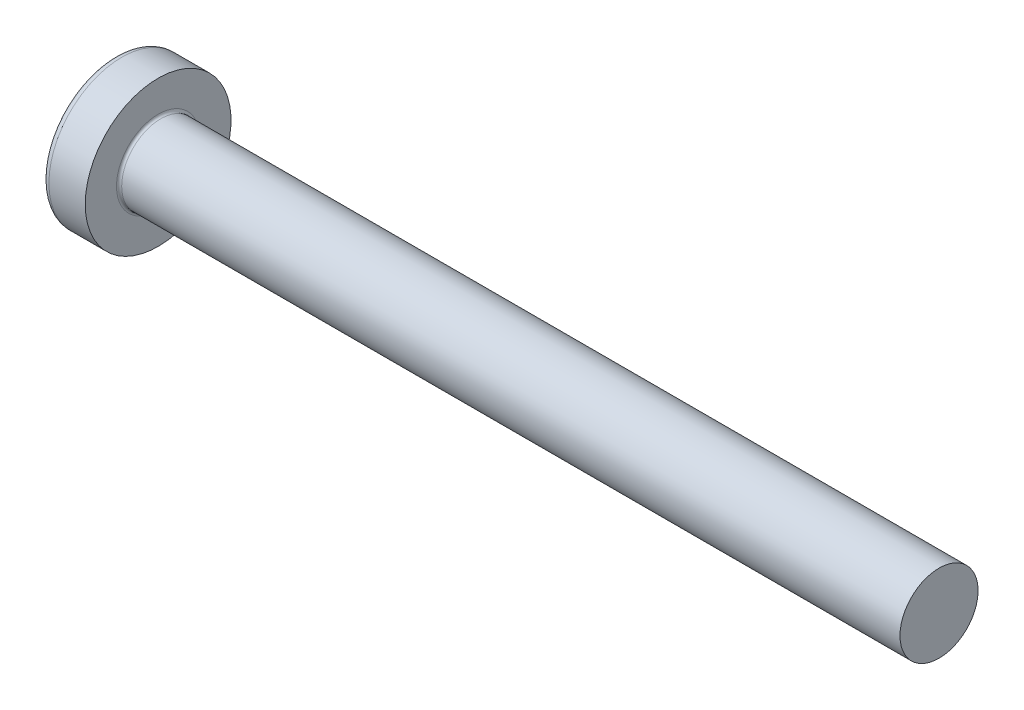
ISO-10303-21;
HEADER;
FILE_DESCRIPTION(('STEP AP214'),'2;1');
FILE_NAME('part.step','',(''),(''),'','','');
FILE_SCHEMA(('AUTOMOTIVE_DESIGN { 1 0 10303 214 1 1 1 1 }'));
ENDSEC;
DATA;
#1=APPLICATION_CONTEXT('core data for automotive mechanical design processes');
#2=APPLICATION_PROTOCOL_DEFINITION('international standard','automotive_design',2000,#1);
#3=PRODUCT_CONTEXT('',#1,'mechanical');
#4=PRODUCT('Part','Part','',(#3));
#5=PRODUCT_RELATED_PRODUCT_CATEGORY('part','',(#4));
#6=PRODUCT_DEFINITION_FORMATION('','',#4);
#7=PRODUCT_DEFINITION_CONTEXT('part definition',#1,'design');
#8=PRODUCT_DEFINITION('design','',#6,#7);
#9=PRODUCT_DEFINITION_SHAPE('','',#8);
#10=(LENGTH_UNIT() NAMED_UNIT(*) SI_UNIT(.MILLI.,.METRE.));
#11=(NAMED_UNIT(*) PLANE_ANGLE_UNIT() SI_UNIT($,.RADIAN.));
#12=(NAMED_UNIT(*) SI_UNIT($,.STERADIAN.) SOLID_ANGLE_UNIT());
#13=UNCERTAINTY_MEASURE_WITH_UNIT(LENGTH_MEASURE(1.E-05),#10,'distance_accuracy_value','');
#14=(GEOMETRIC_REPRESENTATION_CONTEXT(3) GLOBAL_UNCERTAINTY_ASSIGNED_CONTEXT((#13)) GLOBAL_UNIT_ASSIGNED_CONTEXT((#10,
#11,#12)) REPRESENTATION_CONTEXT('',''));
#15=CARTESIAN_POINT('',(0.,0.,0.));
#16=DIRECTION('',(0.,0.,1.));
#17=DIRECTION('',(1.,0.,0.));
#18=AXIS2_PLACEMENT_3D('',#15,#16,#17);
#19=CARTESIAN_POINT('',(5.,0.,0.));
#20=DIRECTION('',(-1.,0.,0.));
#21=DIRECTION('',(0.,1.,0.));
#22=AXIS2_PLACEMENT_3D('',#19,#20,#21);
#23=SPHERICAL_SURFACE('',#22,5.);
#24=CARTESIAN_POINT('',(0.775371598933733,0.,0.));
#25=DIRECTION('',(-1.,0.,0.));
#26=DIRECTION('',(0.,0.,1.));
#27=AXIS2_PLACEMENT_3D('',#24,#25,#26);
#28=CIRCLE('',#27,2.67441860465116);
#29=CARTESIAN_POINT('',(0.775371598933733,0.,2.67441860465116));
#30=VERTEX_POINT('',#29);
#31=EDGE_CURVE('E238',#30,#30,#28,.T.);
#32=ORIENTED_EDGE('',*,*,#31,.T.);
#33=EDGE_LOOP('',(#32));
#34=FACE_BOUND('',#33,.T.);
#35=CARTESIAN_POINT('',(0.0457951200896417,0.,0.));
#36=DIRECTION('',(1.,0.,0.));
#37=DIRECTION('',(0.,0.,-1.));
#38=AXIS2_PLACEMENT_3D('',#35,#36,#37);
#39=CIRCLE('',#38,0.675169614150692);
#40=CARTESIAN_POINT('',(0.0457951200896434,-0.369999999999998,-0.564760133040918));
#41=VERTEX_POINT('',#40);
#42=CARTESIAN_POINT('',(0.0457951200896417,-0.564760133040916,-0.37));
#43=VERTEX_POINT('',#42);
#44=EDGE_CURVE('E374',#41,#43,#39,.F.);
#45=ORIENTED_EDGE('',*,*,#44,.F.);
#46=CARTESIAN_POINT('',(5.,-0.37,0.));
#47=DIRECTION('',(0.,1.,0.));
#48=DIRECTION('',(0.,0.,1.));
#49=AXIS2_PLACEMENT_3D('',#46,#47,#48);
#50=CIRCLE('',#49,4.98629120689917);
#51=CARTESIAN_POINT('',(0.18786973422864,-0.369999999999995,-1.30633162146802));
#52=VERTEX_POINT('',#51);
#53=EDGE_CURVE('E300',#52,#41,#50,.T.);
#54=ORIENTED_EDGE('',*,*,#53,.F.);
#55=CARTESIAN_POINT('',(4.56358262530798,0.,0.875317983305919));
#56=DIRECTION('',(0.446197753347436,0.,-0.894934391398443));
#57=DIRECTION('',(-0.894934391398442,0.,-0.446197753347436));
#58=AXIS2_PLACEMENT_3D('',#55,#56,#57);
#59=CIRCLE('',#58,4.90340272700175);
#60=CARTESIAN_POINT('',(0.18786973422864,0.370000000000004,-1.30633162146801));
#61=VERTEX_POINT('',#60);
#62=EDGE_CURVE('E272',#52,#61,#59,.T.);
#63=ORIENTED_EDGE('',*,*,#62,.T.);
#64=CARTESIAN_POINT('',(5.,0.37,0.));
#65=DIRECTION('',(0.,-1.,0.));
#66=DIRECTION('',(0.,0.,-1.));
#67=AXIS2_PLACEMENT_3D('',#64,#65,#66);
#68=CIRCLE('',#67,4.98629120689917);
#69=CARTESIAN_POINT('',(0.0457951200896425,0.370000000000002,-0.564760133040916));
#70=VERTEX_POINT('',#69);
#71=EDGE_CURVE('E327',#70,#61,#68,.T.);
#72=ORIENTED_EDGE('',*,*,#71,.F.);
#73=CARTESIAN_POINT('',(0.0457951200896417,0.564760133040915,-0.37));
#74=VERTEX_POINT('',#73);
#75=EDGE_CURVE('E393',#74,#70,#39,.F.);
#76=ORIENTED_EDGE('',*,*,#75,.F.);
#77=CARTESIAN_POINT('',(5.,0.,-0.37));
#78=DIRECTION('',(0.,0.,1.));
#79=DIRECTION('',(1.,0.,0.));
#80=AXIS2_PLACEMENT_3D('',#77,#78,#79);
#81=CIRCLE('',#80,4.98629120689917);
#82=CARTESIAN_POINT('',(0.187869734228641,1.30633162146802,-0.37));
#83=VERTEX_POINT('',#82);
#84=EDGE_CURVE('E266',#83,#74,#81,.T.);
#85=ORIENTED_EDGE('',*,*,#84,.F.);
#86=CARTESIAN_POINT('',(4.56358262530798,-0.87531798330592,0.));
#87=DIRECTION('',(0.446197753347436,0.894934391398443,0.));
#88=DIRECTION('',(-0.894934391398442,0.446197753347436,0.));
#89=AXIS2_PLACEMENT_3D('',#86,#87,#88);
#90=CIRCLE('',#89,4.90340272700175);
#91=CARTESIAN_POINT('',(0.18786973422864,1.30633162146802,0.37));
#92=VERTEX_POINT('',#91);
#93=EDGE_CURVE('E269',#83,#92,#90,.T.);
#94=ORIENTED_EDGE('',*,*,#93,.T.);
#95=CARTESIAN_POINT('',(5.,0.,0.37));
#96=DIRECTION('',(0.,0.,-1.));
#97=DIRECTION('',(0.,1.,0.));
#98=AXIS2_PLACEMENT_3D('',#95,#96,#97);
#99=CIRCLE('',#98,4.98629120689917);
#100=CARTESIAN_POINT('',(0.0457951200896417,0.56476013304091,0.37));
#101=VERTEX_POINT('',#100);
#102=EDGE_CURVE('E262',#101,#92,#99,.T.);
#103=ORIENTED_EDGE('',*,*,#102,.F.);
#104=CARTESIAN_POINT('',(0.0457951200896434,0.369999999999998,0.564760133040918));
#105=VERTEX_POINT('',#104);
#106=EDGE_CURVE('E392',#105,#101,#39,.F.);
#107=ORIENTED_EDGE('',*,*,#106,.F.);
#108=CARTESIAN_POINT('',(0.187869734228641,0.369999999999995,1.30633162146802));
#109=VERTEX_POINT('',#108);
#110=EDGE_CURVE('E282',#109,#105,#68,.T.);
#111=ORIENTED_EDGE('',*,*,#110,.F.);
#112=CARTESIAN_POINT('',(4.56358262530798,0.,-0.875317983305919));
#113=DIRECTION('',(0.446197753347436,0.,0.894934391398443));
#114=DIRECTION('',(0.894934391398442,0.,-0.446197753347436));
#115=AXIS2_PLACEMENT_3D('',#112,#113,#114);
#116=CIRCLE('',#115,4.90340272700175);
#117=CARTESIAN_POINT('',(0.187869734228641,-0.370000000000004,1.30633162146802));
#118=VERTEX_POINT('',#117);
#119=EDGE_CURVE('E49',#109,#118,#116,.T.);
#120=ORIENTED_EDGE('',*,*,#119,.T.);
#121=CARTESIAN_POINT('',(0.045795120089643,-0.370000000000002,0.564760133040916));
#122=VERTEX_POINT('',#121);
#123=EDGE_CURVE('E279',#122,#118,#50,.T.);
#124=ORIENTED_EDGE('',*,*,#123,.F.);
#125=CARTESIAN_POINT('',(0.0457951200896417,-0.564760133040912,0.37));
#126=VERTEX_POINT('',#125);
#127=EDGE_CURVE('E428',#126,#122,#39,.F.);
#128=ORIENTED_EDGE('',*,*,#127,.F.);
#129=CARTESIAN_POINT('',(0.18786973422864,-1.30633162146802,0.369999999999999));
#130=VERTEX_POINT('',#129);
#131=EDGE_CURVE('E263',#130,#126,#99,.T.);
#132=ORIENTED_EDGE('',*,*,#131,.F.);
#133=CARTESIAN_POINT('',(4.56358262530798,0.875317983305919,0.));
#134=DIRECTION('',(0.446197753347436,-0.894934391398443,0.));
#135=DIRECTION('',(0.894934391398442,0.446197753347436,0.));
#136=AXIS2_PLACEMENT_3D('',#133,#134,#135);
#137=CIRCLE('',#136,4.90340272700175);
#138=CARTESIAN_POINT('',(0.18786973422864,-1.30633162146802,-0.37));
#139=VERTEX_POINT('',#138);
#140=EDGE_CURVE('E259',#130,#139,#137,.T.);
#141=ORIENTED_EDGE('',*,*,#140,.T.);
#142=EDGE_CURVE('E64',#43,#139,#81,.T.);
#143=ORIENTED_EDGE('',*,*,#142,.F.);
#144=EDGE_LOOP('',(#45,#54,#63,#72,#76,#85,#94,#103,#107,#111,#120,#124,#128,#132,#141,#143));
#145=FACE_BOUND('',#144,.T.);
#146=ADVANCED_FACE('F36',(#34,#145),#23,.T.);
#147=CARTESIAN_POINT('',(1.75,0.527482331818931,-0.37));
#148=DIRECTION('',(0.,0.,1.));
#149=DIRECTION('',(1.,0.,0.));
#150=AXIS2_PLACEMENT_3D('',#147,#148,#149);
#151=PLANE('',#150);
#152=ORIENTED_EDGE('',*,*,#84,.T.);
#153=CARTESIAN_POINT('',(-0.987293237053716,0.649401255967161,-0.37));
#154=CARTESIAN_POINT('',(-0.781914975317084,0.632865887002871,-0.37));
#155=CARTESIAN_POINT('',(-0.576547882393372,0.616188977635081,-0.37));
#156=CARTESIAN_POINT('',(-0.165841599226327,0.582441031964227,-0.37));
#157=CARTESIAN_POINT('',(0.0394975903090452,0.56536998705488,-0.37));
#158=CARTESIAN_POINT('',(0.450133475422572,0.530723441326535,-0.37));
#159=CARTESIAN_POINT('',(0.655430171010573,0.513147940624557,-0.37));
#160=CARTESIAN_POINT('',(1.06596140177934,0.477314957985794,-0.37));
#161=CARTESIAN_POINT('',(1.2711959378071,0.459057485806066,-0.37));
#162=CARTESIAN_POINT('',(1.61065292365626,0.428051938688768,-0.37));
#163=CARTESIAN_POINT('',(1.74490059995643,0.415580824990931,-0.37));
#164=CARTESIAN_POINT('',(2.01334321762763,0.390092023404979,-0.37));
#165=CARTESIAN_POINT('',(2.14753815934577,0.377074339177353,-0.37));
#166=CARTESIAN_POINT('',(2.41586354151957,0.350315629452843,-0.37));
#167=CARTESIAN_POINT('',(2.5499939784531,0.33657456817765,-0.37));
#168=CARTESIAN_POINT('',(2.81814173295471,0.308004077741875,-0.37));
#169=CARTESIAN_POINT('',(2.95215904765134,0.293174621747065,-0.37));
#170=CARTESIAN_POINT('',(3.0860955068368,0.277618485071816,-0.37));
#171=B_SPLINE_CURVE_WITH_KNOTS('',3,(#153,#154,#155,#156,#157,#158,#159,#160,#161,#162,#163,
#164,#165,#166,#167,#168,#169,#170),.UNSPECIFIED.,.F.,.F.,(4,2,2,2,2,2,2,2,4),(0.,
0.618128793984691,1.23627109812525,1.85441325887562,2.4725465791681,2.87702276218609,
3.28149623678161,3.68598973550942,4.09049321032311),.UNSPECIFIED.);
#172=CARTESIAN_POINT('',(1.75,0.415013252800437,-0.37));
#173=VERTEX_POINT('',#172);
#174=EDGE_CURVE('E414',#74,#173,#171,.T.);
#175=ORIENTED_EDGE('',*,*,#174,.T.);
#176=DIRECTION('',(0.,1.,0.));
#177=VECTOR('',#176,1.);
#178=CARTESIAN_POINT('',(1.75,-0.527482331818931,-0.37));
#179=LINE('',#178,#177);
#180=CARTESIAN_POINT('',(1.75,0.527482331818932,-0.37));
#181=VERTEX_POINT('',#180);
#182=EDGE_CURVE('E356',#173,#181,#179,.T.);
#183=ORIENTED_EDGE('',*,*,#182,.T.);
#184=DIRECTION('',(0.894934391398442,-0.446197753347436,0.));
#185=VECTOR('',#184,1.);
#186=CARTESIAN_POINT('',(0.,1.4,-0.37));
#187=LINE('',#186,#185);
#188=EDGE_CURVE('E239',#83,#181,#187,.T.);
#189=ORIENTED_EDGE('',*,*,#188,.F.);
#190=EDGE_LOOP('',(#152,#175,#183,#189));
#191=FACE_BOUND('',#190,.T.);
#192=ADVANCED_FACE('F194',(#191),#151,.T.);
#193=CARTESIAN_POINT('',(1.75,-0.527482331818931,-0.37));
#194=VERTEX_POINT('',#193);
#195=CARTESIAN_POINT('',(1.75,-0.415013252800437,-0.37));
#196=VERTEX_POINT('',#195);
#197=EDGE_CURVE('E247',#194,#196,#179,.T.);
#198=ORIENTED_EDGE('',*,*,#197,.T.);
#199=CARTESIAN_POINT('',(-0.987293237053716,-0.649401255967161,-0.37));
#200=CARTESIAN_POINT('',(-0.781914975317084,-0.632865887002871,-0.37));
#201=CARTESIAN_POINT('',(-0.576547882393372,-0.616188977635081,-0.37));
#202=CARTESIAN_POINT('',(-0.165841599226327,-0.582441031964227,-0.37));
#203=CARTESIAN_POINT('',(0.0394975903090452,-0.56536998705488,-0.37));
#204=CARTESIAN_POINT('',(0.450133475422572,-0.530723441326535,-0.37));
#205=CARTESIAN_POINT('',(0.655430171010573,-0.513147940624557,-0.37));
#206=CARTESIAN_POINT('',(1.06596140177934,-0.477314957985794,-0.37));
#207=CARTESIAN_POINT('',(1.2711959378071,-0.459057485806066,-0.37));
#208=CARTESIAN_POINT('',(1.61065292365626,-0.428051938688768,-0.37));
#209=CARTESIAN_POINT('',(1.74490059995643,-0.415580824990931,-0.37));
#210=CARTESIAN_POINT('',(2.01334321762763,-0.390092023404979,-0.37));
#211=CARTESIAN_POINT('',(2.14753815934577,-0.377074339177353,-0.37));
#212=CARTESIAN_POINT('',(2.41586354151957,-0.350315629452843,-0.37));
#213=CARTESIAN_POINT('',(2.5499939784531,-0.33657456817765,-0.37));
#214=CARTESIAN_POINT('',(2.81814173295471,-0.308004077741875,-0.37));
#215=CARTESIAN_POINT('',(2.95215904765134,-0.293174621747065,-0.37));
#216=CARTESIAN_POINT('',(3.0860955068368,-0.277618485071816,-0.37));
#217=B_SPLINE_CURVE_WITH_KNOTS('',3,(#199,#200,#201,#202,#203,#204,#205,#206,#207,#208,#209,
#210,#211,#212,#213,#214,#215,#216),.UNSPECIFIED.,.F.,.F.,(4,2,2,2,2,2,2,2,4),(0.,
0.618128793984691,1.23627109812525,1.85441325887562,2.4725465791681,2.87702276218609,
3.28149623678161,3.68598973550942,4.09049321032311),.UNSPECIFIED.);
#218=EDGE_CURVE('E391',#196,#43,#217,.F.);
#219=ORIENTED_EDGE('',*,*,#218,.T.);
#220=ORIENTED_EDGE('',*,*,#142,.T.);
#221=DIRECTION('',(0.894934391398442,0.446197753347436,0.));
#222=VECTOR('',#221,1.);
#223=CARTESIAN_POINT('',(0.,-1.4,-0.37));
#224=LINE('',#223,#222);
#225=EDGE_CURVE('E330',#139,#194,#224,.T.);
#226=ORIENTED_EDGE('',*,*,#225,.T.);
#227=EDGE_LOOP('',(#198,#219,#220,#226));
#228=FACE_BOUND('',#227,.T.);
#229=ADVANCED_FACE('F200',(#228),#151,.T.);
#230=CARTESIAN_POINT('',(1.75,-0.527482331818931,0.37));
#231=DIRECTION('',(0.,0.,-1.));
#232=DIRECTION('',(0.,1.,0.));
#233=AXIS2_PLACEMENT_3D('',#230,#231,#232);
#234=PLANE('',#233);
#235=DIRECTION('',(0.,-1.,0.));
#236=VECTOR('',#235,1.);
#237=CARTESIAN_POINT('',(1.75,0.527482331818931,0.37));
#238=LINE('',#237,#236);
#239=CARTESIAN_POINT('',(1.75,0.527482331818932,0.37));
#240=VERTEX_POINT('',#239);
#241=CARTESIAN_POINT('',(1.75,0.415013252800437,0.37));
#242=VERTEX_POINT('',#241);
#243=EDGE_CURVE('E339',#240,#242,#238,.T.);
#244=ORIENTED_EDGE('',*,*,#243,.T.);
#245=CARTESIAN_POINT('',(-0.987293237069635,0.649401255968442,0.37));
#246=CARTESIAN_POINT('',(-0.781914975331301,0.632865887004023,0.37));
#247=CARTESIAN_POINT('',(-0.576547882405888,0.616188977636102,0.37));
#248=CARTESIAN_POINT('',(-0.165841599235439,0.582441031964983,0.37));
#249=CARTESIAN_POINT('',(0.0394975903016341,0.5653699870555,0.37));
#250=CARTESIAN_POINT('',(0.450133475420601,0.530723441326706,0.37));
#251=CARTESIAN_POINT('',(0.655430171012341,0.513147940624409,0.37));
#252=CARTESIAN_POINT('',(1.06596140178858,0.477314957984981,0.37));
#253=CARTESIAN_POINT('',(1.27119593782008,0.459057485804908,0.37));
#254=CARTESIAN_POINT('',(1.61065292367297,0.428051938687225,0.37));
#255=CARTESIAN_POINT('',(1.74490059997313,0.415580824989367,0.37));
#256=CARTESIAN_POINT('',(2.01334321764434,0.390092023403371,0.37));
#257=CARTESIAN_POINT('',(2.14753815936247,0.377074339175718,0.37));
#258=CARTESIAN_POINT('',(2.41586354153627,0.350315629451146,0.37));
#259=CARTESIAN_POINT('',(2.54999397846979,0.336574568175918,0.37));
#260=CARTESIAN_POINT('',(2.8181417329714,0.308004077740054,0.37));
#261=CARTESIAN_POINT('',(2.95215904766802,0.29317462174519,0.37));
#262=CARTESIAN_POINT('',(3.08609550685347,0.277618485069873,0.37));
#263=B_SPLINE_CURVE_WITH_KNOTS('',3,(#245,#246,#247,#248,#249,#250,#251,#252,#253,#254,#255,
#256,#257,#258,#259,#260,#261,#262),.UNSPECIFIED.,.F.,.F.,(4,2,2,2,2,2,2,2,4),(0.,
0.618128793989811,1.23627109813549,1.85441325889711,2.47254657920086,2.87702276221884,
3.28149623681436,3.68598973554217,4.09049321035586),.UNSPECIFIED.);
#264=EDGE_CURVE('E668',#242,#101,#263,.F.);
#265=ORIENTED_EDGE('',*,*,#264,.T.);
#266=ORIENTED_EDGE('',*,*,#102,.T.);
#267=DIRECTION('',(0.894934391398442,-0.446197753347436,0.));
#268=VECTOR('',#267,1.);
#269=CARTESIAN_POINT('',(0.,1.4,0.37));
#270=LINE('',#269,#268);
#271=EDGE_CURVE('E244',#92,#240,#270,.T.);
#272=ORIENTED_EDGE('',*,*,#271,.T.);
#273=EDGE_LOOP('',(#244,#265,#266,#272));
#274=FACE_BOUND('',#273,.T.);
#275=ADVANCED_FACE('F410',(#274),#234,.T.);
#276=ORIENTED_EDGE('',*,*,#131,.T.);
#277=CARTESIAN_POINT('',(-0.987293237069635,-0.649401255968442,0.37));
#278=CARTESIAN_POINT('',(-0.781914975331301,-0.632865887004023,0.37));
#279=CARTESIAN_POINT('',(-0.576547882405888,-0.616188977636103,0.37));
#280=CARTESIAN_POINT('',(-0.16584159923544,-0.582441031964983,0.37));
#281=CARTESIAN_POINT('',(0.0394975903016338,-0.5653699870555,0.37));
#282=CARTESIAN_POINT('',(0.450133475420601,-0.530723441326706,0.37));
#283=CARTESIAN_POINT('',(0.655430171012341,-0.513147940624409,0.37));
#284=CARTESIAN_POINT('',(1.06596140178858,-0.477314957984981,0.37));
#285=CARTESIAN_POINT('',(1.27119593782008,-0.459057485804908,0.37));
#286=CARTESIAN_POINT('',(1.61065292367297,-0.428051938687225,0.37));
#287=CARTESIAN_POINT('',(1.74490059997313,-0.415580824989367,0.37));
#288=CARTESIAN_POINT('',(2.01334321764434,-0.390092023403371,0.37));
#289=CARTESIAN_POINT('',(2.14753815936247,-0.377074339175718,0.37));
#290=CARTESIAN_POINT('',(2.41586354153627,-0.350315629451146,0.37));
#291=CARTESIAN_POINT('',(2.54999397846979,-0.336574568175918,0.37));
#292=CARTESIAN_POINT('',(2.8181417329714,-0.308004077740054,0.37));
#293=CARTESIAN_POINT('',(2.95215904766802,-0.29317462174519,0.37));
#294=CARTESIAN_POINT('',(3.08609550685347,-0.277618485069873,0.37));
#295=B_SPLINE_CURVE_WITH_KNOTS('',3,(#277,#278,#279,#280,#281,#282,#283,#284,#285,#286,#287,
#288,#289,#290,#291,#292,#293,#294),.UNSPECIFIED.,.F.,.F.,(4,2,2,2,2,2,2,2,4),(0.,
0.61812879398981,1.23627109813549,1.85441325889711,2.47254657920086,2.87702276221884,
3.28149623681436,3.68598973554217,4.09049321035586),.UNSPECIFIED.);
#296=CARTESIAN_POINT('',(1.75,-0.415013252800437,0.37));
#297=VERTEX_POINT('',#296);
#298=EDGE_CURVE('E429',#126,#297,#295,.T.);
#299=ORIENTED_EDGE('',*,*,#298,.T.);
#300=CARTESIAN_POINT('',(1.75,-0.527482331818931,0.37));
#301=VERTEX_POINT('',#300);
#302=EDGE_CURVE('E341',#297,#301,#238,.T.);
#303=ORIENTED_EDGE('',*,*,#302,.T.);
#304=DIRECTION('',(0.894934391398442,0.446197753347436,0.));
#305=VECTOR('',#304,1.);
#306=CARTESIAN_POINT('',(0.,-1.4,0.369999999999999));
#307=LINE('',#306,#305);
#308=EDGE_CURVE('E332',#130,#301,#307,.T.);
#309=ORIENTED_EDGE('',*,*,#308,.F.);
#310=EDGE_LOOP('',(#276,#299,#303,#309));
#311=FACE_BOUND('',#310,.T.);
#312=ADVANCED_FACE('F514',(#311),#234,.T.);
#313=CARTESIAN_POINT('',(1.75,0.527482331818931,0.37));
#314=DIRECTION('',(0.446197753347436,0.894934391398443,0.));
#315=DIRECTION('',(-0.894934391398442,0.446197753347436,0.));
#316=AXIS2_PLACEMENT_3D('',#313,#314,#315);
#317=PLANE('',#316);
#318=CARTESIAN_POINT('',(2.6696526882832,0.0689604923233249,0.));
#319=DIRECTION('',(0.446197753347436,0.894934391398443,0.));
#320=DIRECTION('',(-0.894934391398443,0.446197753347436,0.));
#321=AXIS2_PLACEMENT_3D('',#318,#319,#320);
#322=ELLIPSE('',#321,1.10195897609154,0.486831694838766);
#323=CARTESIAN_POINT('',(1.75,0.527482331818932,0.175779377683681));
#324=VERTEX_POINT('',#323);
#325=CARTESIAN_POINT('',(1.75,0.527482331818932,-0.175779377683681));
#326=VERTEX_POINT('',#325);
#327=EDGE_CURVE('E305',#324,#326,#322,.F.);
#328=ORIENTED_EDGE('',*,*,#327,.F.);
#329=DIRECTION('',(0.,0.,-1.));
#330=VECTOR('',#329,1.);
#331=CARTESIAN_POINT('',(1.75,0.527482331818931,0.37));
#332=LINE('',#331,#330);
#333=EDGE_CURVE('E342',#240,#324,#332,.T.);
#334=ORIENTED_EDGE('',*,*,#333,.F.);
#335=ORIENTED_EDGE('',*,*,#271,.F.);
#336=ORIENTED_EDGE('',*,*,#93,.F.);
#337=ORIENTED_EDGE('',*,*,#188,.T.);
#338=EDGE_CURVE('E344',#326,#181,#332,.T.);
#339=ORIENTED_EDGE('',*,*,#338,.F.);
#340=EDGE_LOOP('',(#328,#334,#335,#336,#337,#339));
#341=FACE_BOUND('',#340,.T.);
#342=ADVANCED_FACE('F408',(#341),#317,.F.);
#343=CARTESIAN_POINT('',(0.,-1.4,-0.37));
#344=DIRECTION('',(0.446197753347436,-0.894934391398443,0.));
#345=DIRECTION('',(0.894934391398442,0.446197753347436,0.));
#346=AXIS2_PLACEMENT_3D('',#343,#344,#345);
#347=PLANE('',#346);
#348=CARTESIAN_POINT('',(2.6696526882832,-0.068960492323325,0.));
#349=DIRECTION('',(0.446197753347436,-0.894934391398443,0.));
#350=DIRECTION('',(-0.894934391398443,-0.446197753347436,0.));
#351=AXIS2_PLACEMENT_3D('',#348,#349,#350);
#352=ELLIPSE('',#351,1.10195897609154,0.486831694838766);
#353=CARTESIAN_POINT('',(1.75,-0.527482331818932,-0.175779377683682));
#354=VERTEX_POINT('',#353);
#355=CARTESIAN_POINT('',(1.75,-0.527482331818932,0.175779377683681));
#356=VERTEX_POINT('',#355);
#357=EDGE_CURVE('E670',#354,#356,#352,.F.);
#358=ORIENTED_EDGE('',*,*,#357,.F.);
#359=DIRECTION('',(0.,0.,1.));
#360=VECTOR('',#359,1.);
#361=CARTESIAN_POINT('',(1.75,-0.527482331818931,-0.37));
#362=LINE('',#361,#360);
#363=EDGE_CURVE('E335',#194,#354,#362,.T.);
#364=ORIENTED_EDGE('',*,*,#363,.F.);
#365=ORIENTED_EDGE('',*,*,#225,.F.);
#366=ORIENTED_EDGE('',*,*,#140,.F.);
#367=ORIENTED_EDGE('',*,*,#308,.T.);
#368=EDGE_CURVE('E338',#356,#301,#362,.T.);
#369=ORIENTED_EDGE('',*,*,#368,.F.);
#370=EDGE_LOOP('',(#358,#364,#365,#366,#367,#369));
#371=FACE_BOUND('',#370,.T.);
#372=ADVANCED_FACE('F501',(#371),#347,.F.);
#373=CARTESIAN_POINT('',(1.75,0.527482331818931,-0.37));
#374=DIRECTION('',(-1.,0.,0.));
#375=DIRECTION('',(0.,0.,1.));
#376=AXIS2_PLACEMENT_3D('',#373,#374,#375);
#377=PLANE('',#376);
#378=DIRECTION('',(0.,1.,0.));
#379=VECTOR('',#378,1.);
#380=CARTESIAN_POINT('',(1.75,-0.370000000000002,0.52748233181893));
#381=LINE('',#380,#379);
#382=CARTESIAN_POINT('',(1.75,-0.370000000000002,0.52748233181893));
#383=VERTEX_POINT('',#382);
#384=CARTESIAN_POINT('',(1.75,-0.175779377683684,0.527482331818931));
#385=VERTEX_POINT('',#384);
#386=EDGE_CURVE('E320',#383,#385,#381,.T.);
#387=ORIENTED_EDGE('',*,*,#386,.T.);
#388=CARTESIAN_POINT('',(1.75,0.,0.));
#389=DIRECTION('',(-1.,0.,0.));
#390=DIRECTION('',(0.,0.,1.));
#391=AXIS2_PLACEMENT_3D('',#388,#389,#390);
#392=CIRCLE('',#391,0.556);
#393=CARTESIAN_POINT('',(1.75,-0.370000000000001,0.415013252800437));
#394=VERTEX_POINT('',#393);
#395=EDGE_CURVE('E696',#394,#385,#392,.T.);
#396=ORIENTED_EDGE('',*,*,#395,.F.);
#397=DIRECTION('',(0.,0.,-1.));
#398=VECTOR('',#397,1.);
#399=CARTESIAN_POINT('',(1.75,-0.370000000000002,0.52748233181893));
#400=LINE('',#399,#398);
#401=EDGE_CURVE('E316',#383,#394,#400,.T.);
#402=ORIENTED_EDGE('',*,*,#401,.F.);
#403=EDGE_LOOP('',(#387,#396,#402));
#404=FACE_BOUND('',#403,.T.);
#405=ADVANCED_FACE('F494',(#404),#377,.T.);
#406=ORIENTED_EDGE('',*,*,#302,.F.);
#407=EDGE_CURVE('E701',#356,#297,#392,.T.);
#408=ORIENTED_EDGE('',*,*,#407,.F.);
#409=ORIENTED_EDGE('',*,*,#368,.T.);
#410=EDGE_LOOP('',(#406,#408,#409));
#411=FACE_BOUND('',#410,.T.);
#412=ADVANCED_FACE('F487',(#411),#377,.T.);
#413=ORIENTED_EDGE('',*,*,#363,.T.);
#414=EDGE_CURVE('E385',#196,#354,#392,.T.);
#415=ORIENTED_EDGE('',*,*,#414,.F.);
#416=ORIENTED_EDGE('',*,*,#197,.F.);
#417=EDGE_LOOP('',(#413,#415,#416));
#418=FACE_BOUND('',#417,.T.);
#419=ADVANCED_FACE('F481',(#418),#377,.T.);
#420=CARTESIAN_POINT('',(1.75,-0.369999999999998,-0.415013252800438));
#421=VERTEX_POINT('',#420);
#422=CARTESIAN_POINT('',(1.75,-0.369999999999998,-0.527482331818932));
#423=VERTEX_POINT('',#422);
#424=EDGE_CURVE('E319',#421,#423,#400,.T.);
#425=ORIENTED_EDGE('',*,*,#424,.F.);
#426=CARTESIAN_POINT('',(1.75,-0.175779377683682,-0.527482331818932));
#427=VERTEX_POINT('',#426);
#428=EDGE_CURVE('E56',#427,#421,#392,.T.);
#429=ORIENTED_EDGE('',*,*,#428,.F.);
#430=DIRECTION('',(0.,-1.,0.));
#431=VECTOR('',#430,1.);
#432=CARTESIAN_POINT('',(1.75,0.370000000000002,-0.52748233181893));
#433=LINE('',#432,#431);
#434=EDGE_CURVE('E315',#427,#423,#433,.T.);
#435=ORIENTED_EDGE('',*,*,#434,.T.);
#436=EDGE_LOOP('',(#425,#429,#435));
#437=FACE_BOUND('',#436,.T.);
#438=ADVANCED_FACE('F380',(#437),#377,.T.);
#439=CARTESIAN_POINT('',(1.75,0.370000000000002,-0.52748233181893));
#440=VERTEX_POINT('',#439);
#441=CARTESIAN_POINT('',(1.75,0.175779377683685,-0.527482331818931));
#442=VERTEX_POINT('',#441);
#443=EDGE_CURVE('E312',#440,#442,#433,.T.);
#444=ORIENTED_EDGE('',*,*,#443,.T.);
#445=CARTESIAN_POINT('',(1.75,0.370000000000001,-0.415013252800436));
#446=VERTEX_POINT('',#445);
#447=EDGE_CURVE('E384',#446,#442,#392,.T.);
#448=ORIENTED_EDGE('',*,*,#447,.F.);
#449=DIRECTION('',(0.,0.,1.));
#450=VECTOR('',#449,1.);
#451=CARTESIAN_POINT('',(1.75,0.370000000000002,-0.52748233181893));
#452=LINE('',#451,#450);
#453=EDGE_CURVE('E324',#440,#446,#452,.T.);
#454=ORIENTED_EDGE('',*,*,#453,.F.);
#455=EDGE_LOOP('',(#444,#448,#454));
#456=FACE_BOUND('',#455,.T.);
#457=ADVANCED_FACE('F469',(#456),#377,.T.);
#458=ORIENTED_EDGE('',*,*,#182,.F.);
#459=EDGE_CURVE('E685',#326,#173,#392,.T.);
#460=ORIENTED_EDGE('',*,*,#459,.F.);
#461=ORIENTED_EDGE('',*,*,#338,.T.);
#462=EDGE_LOOP('',(#458,#460,#461));
#463=FACE_BOUND('',#462,.T.);
#464=ADVANCED_FACE('F462',(#463),#377,.T.);
#465=ORIENTED_EDGE('',*,*,#333,.T.);
#466=EDGE_CURVE('E687',#242,#324,#392,.T.);
#467=ORIENTED_EDGE('',*,*,#466,.F.);
#468=ORIENTED_EDGE('',*,*,#243,.F.);
#469=EDGE_LOOP('',(#465,#467,#468));
#470=FACE_BOUND('',#469,.T.);
#471=ADVANCED_FACE('F456',(#470),#377,.T.);
#472=CARTESIAN_POINT('',(1.75,0.369999999999998,0.527482331818933));
#473=DIRECTION('',(0.,-1.,0.));
#474=DIRECTION('',(1.,0.,0.));
#475=AXIS2_PLACEMENT_3D('',#472,#473,#474);
#476=PLANE('',#475);
#477=ORIENTED_EDGE('',*,*,#110,.T.);
#478=CARTESIAN_POINT('',(-0.987293237069635,0.369999999999998,0.649401255968443));
#479=CARTESIAN_POINT('',(-0.781914975331301,0.369999999999998,0.632865887004024));
#480=CARTESIAN_POINT('',(-0.576547882405888,0.369999999999998,0.616188977636103));
#481=CARTESIAN_POINT('',(-0.16584159923544,0.369999999999998,0.582441031964984));
#482=CARTESIAN_POINT('',(0.0394975903016338,0.369999999999998,0.565369987055501));
#483=CARTESIAN_POINT('',(0.450133475420601,0.369999999999998,0.530723441326707));
#484=CARTESIAN_POINT('',(0.655430171012341,0.369999999999998,0.51314794062441));
#485=CARTESIAN_POINT('',(1.06596140178858,0.369999999999998,0.477314957984982));
#486=CARTESIAN_POINT('',(1.27119593782008,0.369999999999998,0.459057485804909));
#487=CARTESIAN_POINT('',(1.61065292367297,0.369999999999999,0.428051938687226));
#488=CARTESIAN_POINT('',(1.74490059997313,0.369999999999999,0.415580824989369));
#489=CARTESIAN_POINT('',(2.01334321764434,0.369999999999999,0.390092023403372));
#490=CARTESIAN_POINT('',(2.14753815936247,0.369999999999999,0.37707433917572));
#491=CARTESIAN_POINT('',(2.41586354153627,0.369999999999999,0.350315629451147));
#492=CARTESIAN_POINT('',(2.54999397846979,0.369999999999999,0.336574568175919));
#493=CARTESIAN_POINT('',(2.8181417329714,0.369999999999999,0.308004077740055));
#494=CARTESIAN_POINT('',(2.95215904766802,0.369999999999999,0.293174621745191));
#495=CARTESIAN_POINT('',(3.08609550685347,0.369999999999999,0.277618485069875));
#496=B_SPLINE_CURVE_WITH_KNOTS('',3,(#478,#479,#480,#481,#482,#483,#484,#485,#486,#487,#488,
#489,#490,#491,#492,#493,#494,#495),.UNSPECIFIED.,.F.,.F.,(4,2,2,2,2,2,2,2,4),(0.,
0.61812879398981,1.23627109813549,1.85441325889711,2.47254657920086,2.87702276221884,
3.28149623681436,3.68598973554218,4.09049321035586),.UNSPECIFIED.);
#497=CARTESIAN_POINT('',(1.75,0.369999999999999,0.415013252800439));
#498=VERTEX_POINT('',#497);
#499=EDGE_CURVE('E667',#105,#498,#496,.T.);
#500=ORIENTED_EDGE('',*,*,#499,.T.);
#501=CARTESIAN_POINT('',(1.75,0.369999999999998,0.527482331818933));
#502=VERTEX_POINT('',#501);
#503=EDGE_CURVE('E297',#498,#502,#452,.T.);
#504=ORIENTED_EDGE('',*,*,#503,.T.);
#505=DIRECTION('',(0.894934391398442,0.,-0.446197753347436));
#506=VECTOR('',#505,1.);
#507=CARTESIAN_POINT('',(0.,0.369999999999995,1.4));
#508=LINE('',#507,#506);
#509=EDGE_CURVE('E290',#109,#502,#508,.T.);
#510=ORIENTED_EDGE('',*,*,#509,.F.);
#511=EDGE_LOOP('',(#477,#500,#504,#510));
#512=FACE_BOUND('',#511,.T.);
#513=ADVANCED_FACE('F294',(#512),#476,.T.);
#514=CARTESIAN_POINT('',(1.75,-0.369999999999998,-0.527482331818932));
#515=DIRECTION('',(0.,1.,0.));
#516=DIRECTION('',(0.,0.,1.));
#517=AXIS2_PLACEMENT_3D('',#514,#515,#516);
#518=PLANE('',#517);
#519=ORIENTED_EDGE('',*,*,#401,.T.);
#520=CARTESIAN_POINT('',(-0.987293237053716,-0.370000000000002,0.64940125596716));
#521=CARTESIAN_POINT('',(-0.781914975317084,-0.370000000000002,0.63286588700287));
#522=CARTESIAN_POINT('',(-0.576547882393372,-0.370000000000002,0.616188977635079));
#523=CARTESIAN_POINT('',(-0.165841599226327,-0.370000000000002,0.582441031964226));
#524=CARTESIAN_POINT('',(0.0394975903090453,-0.370000000000002,0.565369987054878));
#525=CARTESIAN_POINT('',(0.450133475422572,-0.370000000000002,0.530723441326534));
#526=CARTESIAN_POINT('',(0.655430171010573,-0.370000000000002,0.513147940624556));
#527=CARTESIAN_POINT('',(1.06596140177934,-0.370000000000001,0.477314957985793));
#528=CARTESIAN_POINT('',(1.2711959378071,-0.370000000000001,0.459057485806065));
#529=CARTESIAN_POINT('',(1.61065292365626,-0.370000000000001,0.428051938688767));
#530=CARTESIAN_POINT('',(1.74490059995643,-0.370000000000001,0.41558082499093));
#531=CARTESIAN_POINT('',(2.01334321762763,-0.370000000000001,0.390092023404978));
#532=CARTESIAN_POINT('',(2.14753815934577,-0.370000000000001,0.377074339177352));
#533=CARTESIAN_POINT('',(2.41586354151957,-0.370000000000001,0.350315629452841));
#534=CARTESIAN_POINT('',(2.5499939784531,-0.370000000000001,0.336574568177649));
#535=CARTESIAN_POINT('',(2.81814173295471,-0.370000000000001,0.308004077741874));
#536=CARTESIAN_POINT('',(2.95215904765134,-0.370000000000001,0.293174621747064));
#537=CARTESIAN_POINT('',(3.0860955068368,-0.370000000000001,0.277618485071814));
#538=B_SPLINE_CURVE_WITH_KNOTS('',3,(#520,#521,#522,#523,#524,#525,#526,#527,#528,#529,#530,
#531,#532,#533,#534,#535,#536,#537),.UNSPECIFIED.,.F.,.F.,(4,2,2,2,2,2,2,2,4),(0.,
0.618128793984691,1.23627109812525,1.85441325887562,2.4725465791681,2.87702276218609,
3.28149623678161,3.68598973550942,4.09049321032311),.UNSPECIFIED.);
#539=EDGE_CURVE('E422',#394,#122,#538,.F.);
#540=ORIENTED_EDGE('',*,*,#539,.T.);
#541=ORIENTED_EDGE('',*,*,#123,.T.);
#542=DIRECTION('',(0.894934391398442,0.,-0.446197753347436));
#543=VECTOR('',#542,1.);
#544=CARTESIAN_POINT('',(0.,-0.370000000000005,1.4));
#545=LINE('',#544,#543);
#546=EDGE_CURVE('E292',#118,#383,#545,.T.);
#547=ORIENTED_EDGE('',*,*,#546,.T.);
#548=EDGE_LOOP('',(#519,#540,#541,#547));
#549=FACE_BOUND('',#548,.T.);
#550=ADVANCED_FACE('F229',(#549),#518,.T.);
#551=CARTESIAN_POINT('',(1.75,-0.370000000000002,0.52748233181893));
#552=DIRECTION('',(0.446197753347436,0.,0.894934391398443));
#553=DIRECTION('',(-0.894934391398442,0.,0.446197753347436));
#554=AXIS2_PLACEMENT_3D('',#551,#552,#553);
#555=PLANE('',#554);
#556=CARTESIAN_POINT('',(2.6696526882832,0.,0.068960492323325));
#557=DIRECTION('',(0.446197753347436,0.,0.894934391398443));
#558=DIRECTION('',(-0.894934391398443,0.,0.446197753347436));
#559=AXIS2_PLACEMENT_3D('',#556,#557,#558);
#560=ELLIPSE('',#559,1.10195897609154,0.486831694838766);
#561=CARTESIAN_POINT('',(1.75,0.175779377683681,0.527482331818932));
#562=VERTEX_POINT('',#561);
#563=EDGE_CURVE('E420',#385,#562,#560,.F.);
#564=ORIENTED_EDGE('',*,*,#563,.F.);
#565=ORIENTED_EDGE('',*,*,#386,.F.);
#566=ORIENTED_EDGE('',*,*,#546,.F.);
#567=ORIENTED_EDGE('',*,*,#119,.F.);
#568=ORIENTED_EDGE('',*,*,#509,.T.);
#569=EDGE_CURVE('E323',#562,#502,#381,.T.);
#570=ORIENTED_EDGE('',*,*,#569,.F.);
#571=EDGE_LOOP('',(#564,#565,#566,#567,#568,#570));
#572=FACE_BOUND('',#571,.T.);
#573=ADVANCED_FACE('F288',(#572),#555,.F.);
#574=CARTESIAN_POINT('',(0.,0.370000000000005,-1.4));
#575=DIRECTION('',(0.446197753347436,0.,-0.894934391398443));
#576=DIRECTION('',(0.894934391398442,0.,0.446197753347436));
#577=AXIS2_PLACEMENT_3D('',#574,#575,#576);
#578=PLANE('',#577);
#579=CARTESIAN_POINT('',(2.6696526882832,0.,-0.068960492323325));
#580=DIRECTION('',(0.446197753347436,0.,-0.894934391398443));
#581=DIRECTION('',(-0.894934391398443,0.,-0.446197753347436));
#582=AXIS2_PLACEMENT_3D('',#579,#580,#581);
#583=ELLIPSE('',#582,1.10195897609154,0.486831694838766);
#584=EDGE_CURVE('E378',#442,#427,#583,.F.);
#585=ORIENTED_EDGE('',*,*,#584,.F.);
#586=ORIENTED_EDGE('',*,*,#443,.F.);
#587=DIRECTION('',(0.894934391398442,0.,0.446197753347436));
#588=VECTOR('',#587,1.);
#589=CARTESIAN_POINT('',(0.,0.370000000000005,-1.4));
#590=LINE('',#589,#588);
#591=EDGE_CURVE('E302',#61,#440,#590,.T.);
#592=ORIENTED_EDGE('',*,*,#591,.F.);
#593=ORIENTED_EDGE('',*,*,#62,.F.);
#594=DIRECTION('',(0.894934391398442,0.,0.446197753347436));
#595=VECTOR('',#594,1.);
#596=CARTESIAN_POINT('',(0.,-0.369999999999995,-1.4));
#597=LINE('',#596,#595);
#598=EDGE_CURVE('E309',#52,#423,#597,.T.);
#599=ORIENTED_EDGE('',*,*,#598,.T.);
#600=ORIENTED_EDGE('',*,*,#434,.F.);
#601=EDGE_LOOP('',(#585,#586,#592,#593,#599,#600));
#602=FACE_BOUND('',#601,.T.);
#603=ADVANCED_FACE('F369',(#602),#578,.F.);
#604=ORIENTED_EDGE('',*,*,#453,.T.);
#605=CARTESIAN_POINT('',(-0.987293237053716,0.370000000000002,-0.649401255967159));
#606=CARTESIAN_POINT('',(-0.781914975317084,0.370000000000002,-0.63286588700287));
#607=CARTESIAN_POINT('',(-0.576547882393372,0.370000000000002,-0.61618897763508));
#608=CARTESIAN_POINT('',(-0.165841599226327,0.370000000000002,-0.582441031964225));
#609=CARTESIAN_POINT('',(0.039497590309045,0.370000000000002,-0.565369987054878));
#610=CARTESIAN_POINT('',(0.450133475422572,0.370000000000002,-0.530723441326533));
#611=CARTESIAN_POINT('',(0.655430171010573,0.370000000000002,-0.513147940624555));
#612=CARTESIAN_POINT('',(1.06596140177934,0.370000000000002,-0.477314957985793));
#613=CARTESIAN_POINT('',(1.2711959378071,0.370000000000002,-0.459057485806065));
#614=CARTESIAN_POINT('',(1.61065292365626,0.370000000000001,-0.428051938688767));
#615=CARTESIAN_POINT('',(1.74490059995642,0.370000000000001,-0.41558082499093));
#616=CARTESIAN_POINT('',(2.01334321762763,0.370000000000001,-0.390092023404978));
#617=CARTESIAN_POINT('',(2.14753815934577,0.370000000000001,-0.377074339177352));
#618=CARTESIAN_POINT('',(2.41586354151957,0.370000000000001,-0.350315629452841));
#619=CARTESIAN_POINT('',(2.5499939784531,0.370000000000001,-0.336574568177649));
#620=CARTESIAN_POINT('',(2.81814173295471,0.370000000000001,-0.308004077741874));
#621=CARTESIAN_POINT('',(2.95215904765134,0.370000000000001,-0.293174621747064));
#622=CARTESIAN_POINT('',(3.0860955068368,0.370000000000001,-0.277618485071814));
#623=B_SPLINE_CURVE_WITH_KNOTS('',3,(#605,#606,#607,#608,#609,#610,#611,#612,#613,#614,#615,
#616,#617,#618,#619,#620,#621,#622),.UNSPECIFIED.,.F.,.F.,(4,2,2,2,2,2,2,2,4),(0.,
0.618128793984691,1.23627109812525,1.85441325887562,2.4725465791681,2.87702276218609,
3.28149623678161,3.68598973550942,4.09049321032311),.UNSPECIFIED.);
#624=EDGE_CURVE('E365',#446,#70,#623,.F.);
#625=ORIENTED_EDGE('',*,*,#624,.T.);
#626=ORIENTED_EDGE('',*,*,#71,.T.);
#627=ORIENTED_EDGE('',*,*,#591,.T.);
#628=EDGE_LOOP('',(#604,#625,#626,#627));
#629=FACE_BOUND('',#628,.T.);
#630=ADVANCED_FACE('F227',(#629),#476,.T.);
#631=ORIENTED_EDGE('',*,*,#53,.T.);
#632=CARTESIAN_POINT('',(-0.987293237053716,-0.369999999999997,-0.649401255967162));
#633=CARTESIAN_POINT('',(-0.781914975317084,-0.369999999999997,-0.632865887002873));
#634=CARTESIAN_POINT('',(-0.576547882393372,-0.369999999999997,-0.616188977635082));
#635=CARTESIAN_POINT('',(-0.165841599226327,-0.369999999999998,-0.582441031964228));
#636=CARTESIAN_POINT('',(0.0394975903090453,-0.369999999999998,-0.565369987054881));
#637=CARTESIAN_POINT('',(0.450133475422572,-0.369999999999998,-0.530723441326536));
#638=CARTESIAN_POINT('',(0.655430171010573,-0.369999999999998,-0.513147940624558));
#639=CARTESIAN_POINT('',(1.06596140177934,-0.369999999999998,-0.477314957985795));
#640=CARTESIAN_POINT('',(1.2711959378071,-0.369999999999998,-0.459057485806068));
#641=CARTESIAN_POINT('',(1.61065292365626,-0.369999999999998,-0.42805193868877));
#642=CARTESIAN_POINT('',(1.74490059995643,-0.369999999999998,-0.415580824990932));
#643=CARTESIAN_POINT('',(2.01334321762763,-0.369999999999998,-0.390092023404981));
#644=CARTESIAN_POINT('',(2.14753815934577,-0.369999999999999,-0.377074339177355));
#645=CARTESIAN_POINT('',(2.41586354151957,-0.369999999999999,-0.350315629452844));
#646=CARTESIAN_POINT('',(2.5499939784531,-0.369999999999999,-0.336574568177652));
#647=CARTESIAN_POINT('',(2.81814173295471,-0.369999999999999,-0.308004077741877));
#648=CARTESIAN_POINT('',(2.95215904765134,-0.369999999999999,-0.293174621747066));
#649=CARTESIAN_POINT('',(3.0860955068368,-0.369999999999999,-0.277618485071817));
#650=B_SPLINE_CURVE_WITH_KNOTS('',3,(#632,#633,#634,#635,#636,#637,#638,#639,#640,#641,#642,
#643,#644,#645,#646,#647,#648,#649),.UNSPECIFIED.,.F.,.F.,(4,2,2,2,2,2,2,2,4),(0.,
0.618128793984691,1.23627109812525,1.85441325887562,2.4725465791681,2.87702276218609,
3.28149623678161,3.68598973550942,4.09049321032311),.UNSPECIFIED.);
#651=EDGE_CURVE('E11',#41,#421,#650,.T.);
#652=ORIENTED_EDGE('',*,*,#651,.T.);
#653=ORIENTED_EDGE('',*,*,#424,.T.);
#654=ORIENTED_EDGE('',*,*,#598,.F.);
#655=EDGE_LOOP('',(#631,#652,#653,#654));
#656=FACE_BOUND('',#655,.T.);
#657=ADVANCED_FACE('F222',(#656),#518,.T.);
#658=CARTESIAN_POINT('',(-25.4,0.,0.));
#659=DIRECTION('',(-1.,0.,0.));
#660=DIRECTION('',(0.,0.,1.));
#661=AXIS2_PLACEMENT_3D('',#658,#659,#660);
#662=CYLINDRICAL_SURFACE('',#661,1.5);
#663=CARTESIAN_POINT('',(2.5,0.,0.));
#664=DIRECTION('',(-1.,0.,0.));
#665=DIRECTION('',(0.,0.,1.));
#666=AXIS2_PLACEMENT_3D('',#663,#664,#665);
#667=CIRCLE('',#666,1.5);
#668=CARTESIAN_POINT('',(2.5,0.,1.5));
#669=VERTEX_POINT('',#668);
#670=EDGE_CURVE('E233',#669,#669,#667,.F.);
#671=ORIENTED_EDGE('',*,*,#670,.T.);
#672=EDGE_LOOP('',(#671));
#673=FACE_BOUND('',#672,.T.);
#674=CARTESIAN_POINT('',(32.4,0.,0.));
#675=DIRECTION('',(-1.,0.,0.));
#676=DIRECTION('',(0.,0.,1.));
#677=AXIS2_PLACEMENT_3D('',#674,#675,#676);
#678=CIRCLE('',#677,1.5);
#679=CARTESIAN_POINT('',(32.4,0.,1.5));
#680=VERTEX_POINT('',#679);
#681=EDGE_CURVE('E236',#680,#680,#678,.T.);
#682=ORIENTED_EDGE('',*,*,#681,.T.);
#683=EDGE_LOOP('',(#682));
#684=FACE_BOUND('',#683,.T.);
#685=ADVANCED_FACE('F219',(#673,#684),#662,.T.);
#686=CARTESIAN_POINT('',(2.4,1.5,0.));
#687=DIRECTION('',(-1.,0.,0.));
#688=DIRECTION('',(0.,0.,1.));
#689=AXIS2_PLACEMENT_3D('',#686,#687,#688);
#690=PLANE('',#689);
#691=CARTESIAN_POINT('',(2.4,0.,0.));
#692=DIRECTION('',(-1.,0.,0.));
#693=DIRECTION('',(0.,0.,1.));
#694=AXIS2_PLACEMENT_3D('',#691,#692,#693);
#695=CIRCLE('',#694,1.6);
#696=CARTESIAN_POINT('',(2.4,0.,1.6));
#697=VERTEX_POINT('',#696);
#698=EDGE_CURVE('E255',#697,#697,#695,.T.);
#699=ORIENTED_EDGE('',*,*,#698,.T.);
#700=EDGE_LOOP('',(#699));
#701=FACE_BOUND('',#700,.T.);
#702=CARTESIAN_POINT('',(2.4,0.,0.));
#703=DIRECTION('',(-1.,0.,0.));
#704=DIRECTION('',(0.,0.,1.));
#705=AXIS2_PLACEMENT_3D('',#702,#703,#704);
#706=CIRCLE('',#705,2.8);
#707=CARTESIAN_POINT('',(2.4,0.,2.8));
#708=VERTEX_POINT('',#707);
#709=EDGE_CURVE('E252',#708,#708,#706,.T.);
#710=ORIENTED_EDGE('',*,*,#709,.F.);
#711=EDGE_LOOP('',(#710));
#712=FACE_BOUND('',#711,.T.);
#713=ADVANCED_FACE('F216',(#701,#712),#690,.F.);
#714=CARTESIAN_POINT('',(-25.4,0.,0.));
#715=DIRECTION('',(-1.,0.,0.));
#716=DIRECTION('',(0.,0.,1.));
#717=AXIS2_PLACEMENT_3D('',#714,#715,#716);
#718=CYLINDRICAL_SURFACE('',#717,2.8);
#719=ORIENTED_EDGE('',*,*,#709,.T.);
#720=EDGE_LOOP('',(#719));
#721=FACE_BOUND('',#720,.T.);
#722=CARTESIAN_POINT('',(1.00350153259131,0.,0.));
#723=DIRECTION('',(-1.,0.,0.));
#724=DIRECTION('',(0.,0.,1.));
#725=AXIS2_PLACEMENT_3D('',#722,#723,#724);
#726=CIRCLE('',#725,2.8);
#727=CARTESIAN_POINT('',(1.00350153259131,0.,2.8));
#728=VERTEX_POINT('',#727);
#729=EDGE_CURVE('E241',#728,#728,#726,.T.);
#730=ORIENTED_EDGE('',*,*,#729,.F.);
#731=EDGE_LOOP('',(#730));
#732=FACE_BOUND('',#731,.T.);
#733=ADVANCED_FACE('F212',(#721,#732),#718,.T.);
#734=CARTESIAN_POINT('',(1.00350153259131,0.,0.));
#735=DIRECTION('',(-1.,0.,0.));
#736=DIRECTION('',(0.,0.,1.));
#737=AXIS2_PLACEMENT_3D('',#734,#735,#736);
#738=TOROIDAL_SURFACE('',#737,2.53,0.27);
#739=ORIENTED_EDGE('',*,*,#729,.T.);
#740=EDGE_LOOP('',(#739));
#741=FACE_BOUND('',#740,.T.);
#742=ORIENTED_EDGE('',*,*,#31,.F.);
#743=EDGE_LOOP('',(#742));
#744=FACE_BOUND('',#743,.T.);
#745=ADVANCED_FACE('F209',(#741,#744),#738,.T.);
#746=CARTESIAN_POINT('',(32.4,1.5,0.));
#747=DIRECTION('',(1.,0.,0.));
#748=DIRECTION('',(0.,0.,-1.));
#749=AXIS2_PLACEMENT_3D('',#746,#747,#748);
#750=PLANE('',#749);
#751=ORIENTED_EDGE('',*,*,#681,.F.);
#752=EDGE_LOOP('',(#751));
#753=FACE_BOUND('',#752,.T.);
#754=ADVANCED_FACE('F207',(#753),#750,.T.);
#755=CARTESIAN_POINT('',(2.5,0.,0.));
#756=DIRECTION('',(-1.,0.,0.));
#757=DIRECTION('',(0.,0.,1.));
#758=AXIS2_PLACEMENT_3D('',#755,#756,#757);
#759=TOROIDAL_SURFACE('',#758,1.6,0.1);
#760=ORIENTED_EDGE('',*,*,#670,.F.);
#761=EDGE_LOOP('',(#760));
#762=FACE_BOUND('',#761,.T.);
#763=ORIENTED_EDGE('',*,*,#698,.F.);
#764=EDGE_LOOP('',(#763));
#765=FACE_BOUND('',#764,.T.);
#766=ADVANCED_FACE('F38',(#762,#765),#759,.F.);
#767=ORIENTED_EDGE('',*,*,#503,.F.);
#768=EDGE_CURVE('E386',#562,#498,#392,.T.);
#769=ORIENTED_EDGE('',*,*,#768,.F.);
#770=ORIENTED_EDGE('',*,*,#569,.T.);
#771=EDGE_LOOP('',(#767,#769,#770));
#772=FACE_BOUND('',#771,.T.);
#773=ADVANCED_FACE('F463',(#772),#377,.T.);
#774=CARTESIAN_POINT('',(1.75,0.,0.));
#775=DIRECTION('',(-1.,0.,0.));
#776=DIRECTION('',(0.,0.,1.));
#777=AXIS2_PLACEMENT_3D('',#774,#775,#776);
#778=CONICAL_SURFACE('',#777,0.556,0.0698131700797659);
#779=ORIENTED_EDGE('',*,*,#327,.T.);
#780=EDGE_CURVE('E682',#324,#326,#392,.T.);
#781=ORIENTED_EDGE('',*,*,#780,.F.);
#782=EDGE_LOOP('',(#779,#781));
#783=FACE_BOUND('',#782,.T.);
#784=ADVANCED_FACE('F191',(#783),#778,.F.);
#785=ORIENTED_EDGE('',*,*,#357,.T.);
#786=EDGE_CURVE('E702',#354,#356,#392,.T.);
#787=ORIENTED_EDGE('',*,*,#786,.F.);
#788=EDGE_LOOP('',(#785,#787));
#789=FACE_BOUND('',#788,.T.);
#790=ADVANCED_FACE('F598',(#789),#778,.F.);
#791=EDGE_CURVE('E388',#498,#242,#392,.T.);
#792=ORIENTED_EDGE('',*,*,#791,.F.);
#793=ORIENTED_EDGE('',*,*,#499,.F.);
#794=ORIENTED_EDGE('',*,*,#106,.T.);
#795=ORIENTED_EDGE('',*,*,#264,.F.);
#796=EDGE_LOOP('',(#792,#793,#794,#795));
#797=FACE_BOUND('',#796,.T.);
#798=ADVANCED_FACE('F604',(#797),#778,.F.);
#799=ORIENTED_EDGE('',*,*,#563,.T.);
#800=EDGE_CURVE('E389',#385,#562,#392,.T.);
#801=ORIENTED_EDGE('',*,*,#800,.F.);
#802=EDGE_LOOP('',(#799,#801));
#803=FACE_BOUND('',#802,.T.);
#804=ADVANCED_FACE('F611',(#803),#778,.F.);
#805=ORIENTED_EDGE('',*,*,#584,.T.);
#806=EDGE_CURVE('E381',#442,#427,#392,.T.);
#807=ORIENTED_EDGE('',*,*,#806,.F.);
#808=EDGE_LOOP('',(#805,#807));
#809=FACE_BOUND('',#808,.T.);
#810=ADVANCED_FACE('F618',(#809),#778,.F.);
#811=ORIENTED_EDGE('',*,*,#127,.T.);
#812=ORIENTED_EDGE('',*,*,#539,.F.);
#813=EDGE_CURVE('E698',#297,#394,#392,.T.);
#814=ORIENTED_EDGE('',*,*,#813,.F.);
#815=ORIENTED_EDGE('',*,*,#298,.F.);
#816=EDGE_LOOP('',(#811,#812,#814,#815));
#817=FACE_BOUND('',#816,.T.);
#818=ADVANCED_FACE('F625',(#817),#778,.F.);
#819=ORIENTED_EDGE('',*,*,#75,.T.);
#820=ORIENTED_EDGE('',*,*,#624,.F.);
#821=EDGE_CURVE('E688',#173,#446,#392,.T.);
#822=ORIENTED_EDGE('',*,*,#821,.F.);
#823=ORIENTED_EDGE('',*,*,#174,.F.);
#824=EDGE_LOOP('',(#819,#820,#822,#823));
#825=FACE_BOUND('',#824,.T.);
#826=ADVANCED_FACE('F189',(#825),#778,.F.);
#827=EDGE_CURVE('E382',#421,#196,#392,.T.);
#828=ORIENTED_EDGE('',*,*,#827,.F.);
#829=ORIENTED_EDGE('',*,*,#651,.F.);
#830=ORIENTED_EDGE('',*,*,#44,.T.);
#831=ORIENTED_EDGE('',*,*,#218,.F.);
#832=EDGE_LOOP('',(#828,#829,#830,#831));
#833=FACE_BOUND('',#832,.T.);
#834=ADVANCED_FACE('F184',(#833),#778,.F.);
#835=CARTESIAN_POINT('',(1.93065535110549,0.,0.));
#836=DIRECTION('',(-1.,0.,0.));
#837=DIRECTION('',(0.,0.,1.));
#838=AXIS2_PLACEMENT_3D('',#835,#836,#837);
#839=CONICAL_SURFACE('',#838,0.,1.25663706143592);
#840=ORIENTED_EDGE('',*,*,#768,.T.);
#841=ORIENTED_EDGE('',*,*,#791,.T.);
#842=ORIENTED_EDGE('',*,*,#466,.T.);
#843=ORIENTED_EDGE('',*,*,#780,.T.);
#844=ORIENTED_EDGE('',*,*,#459,.T.);
#845=ORIENTED_EDGE('',*,*,#821,.T.);
#846=ORIENTED_EDGE('',*,*,#447,.T.);
#847=ORIENTED_EDGE('',*,*,#806,.T.);
#848=ORIENTED_EDGE('',*,*,#428,.T.);
#849=ORIENTED_EDGE('',*,*,#827,.T.);
#850=ORIENTED_EDGE('',*,*,#414,.T.);
#851=ORIENTED_EDGE('',*,*,#786,.T.);
#852=ORIENTED_EDGE('',*,*,#407,.T.);
#853=ORIENTED_EDGE('',*,*,#813,.T.);
#854=ORIENTED_EDGE('',*,*,#395,.T.);
#855=ORIENTED_EDGE('',*,*,#800,.T.);
#856=EDGE_LOOP('',(#840,#841,#842,#843,#844,#845,#846,#847,#848,#849,#850,#851,#852,#853,#854,#855));
#857=FACE_BOUND('',#856,.T.);
#858=CARTESIAN_POINT('',(1.93065535110549,0.,0.));
#859=VERTEX_POINT('',#858);
#860=VERTEX_LOOP('',#859);
#861=FACE_BOUND('',#860,.T.);
#862=ADVANCED_FACE('F182',(#857,#861),#839,.F.);
#863=CLOSED_SHELL('',(#146,#192,#229,#275,#312,#342,#372,#405,#412,#419,#438,#457,#464,#471,
#513,#550,#573,#603,#630,#657,#685,#713,#733,#745,#754,#766,#773,#784,#790,#798,#804,#810,#818,
#826,#834,#862));
#864=MANIFOLD_SOLID_BREP('B2',#863);
#865=ADVANCED_BREP_SHAPE_REPRESENTATION('',(#18,#864),#14);
#866=SHAPE_DEFINITION_REPRESENTATION(#9,#865);
ENDSEC;
END-ISO-10303-21;
